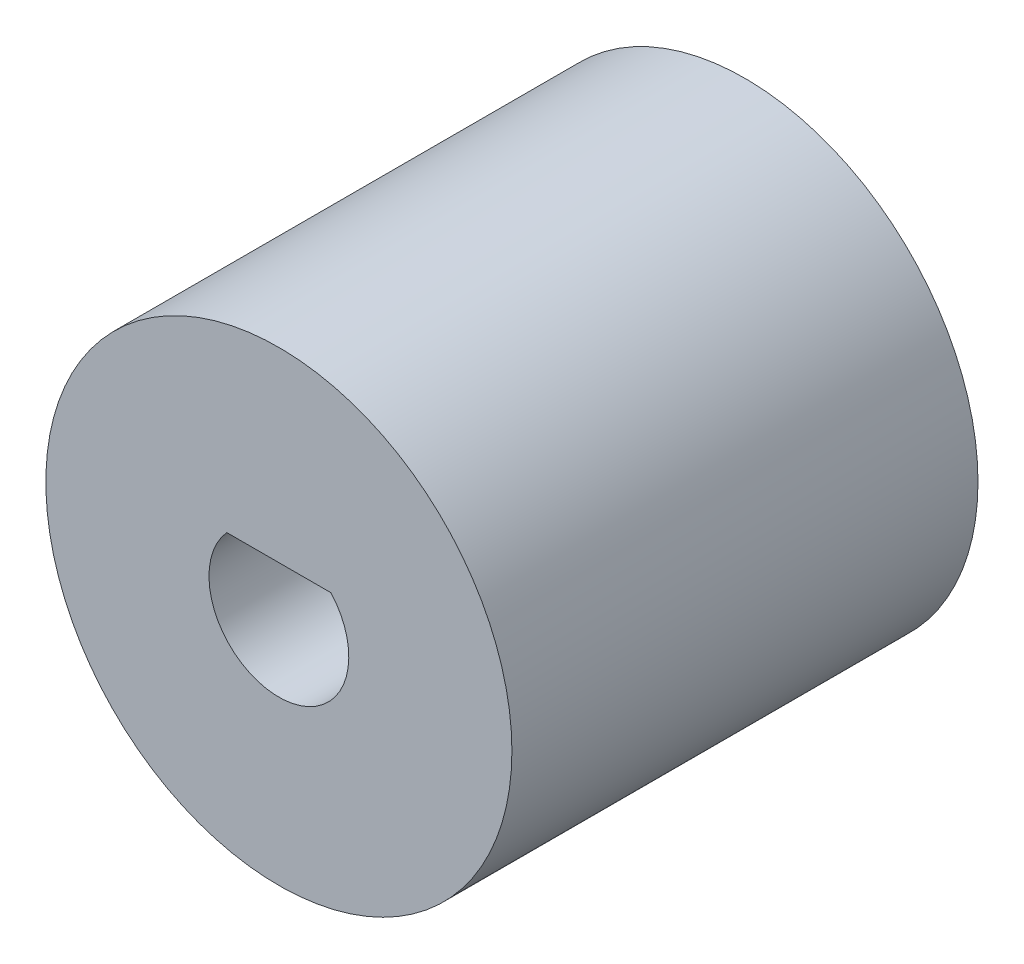
ISO-10303-21;
HEADER;
FILE_DESCRIPTION(('STEP AP214'),'2;1');
FILE_NAME('part.step','',(''),(''),'','','');
FILE_SCHEMA(('AUTOMOTIVE_DESIGN { 1 0 10303 214 1 1 1 1 }'));
ENDSEC;
DATA;
#1=APPLICATION_CONTEXT('core data for automotive mechanical design processes');
#2=APPLICATION_PROTOCOL_DEFINITION('international standard','automotive_design',2000,#1);
#3=PRODUCT_CONTEXT('',#1,'mechanical');
#4=PRODUCT('Part','Part','',(#3));
#5=PRODUCT_RELATED_PRODUCT_CATEGORY('part','',(#4));
#6=PRODUCT_DEFINITION_FORMATION('','',#4);
#7=PRODUCT_DEFINITION_CONTEXT('part definition',#1,'design');
#8=PRODUCT_DEFINITION('design','',#6,#7);
#9=PRODUCT_DEFINITION_SHAPE('','',#8);
#10=(LENGTH_UNIT() NAMED_UNIT(*) SI_UNIT(.MILLI.,.METRE.));
#11=(NAMED_UNIT(*) PLANE_ANGLE_UNIT() SI_UNIT($,.RADIAN.));
#12=(NAMED_UNIT(*) SI_UNIT($,.STERADIAN.) SOLID_ANGLE_UNIT());
#13=UNCERTAINTY_MEASURE_WITH_UNIT(LENGTH_MEASURE(1.E-05),#10,'distance_accuracy_value','');
#14=(GEOMETRIC_REPRESENTATION_CONTEXT(3) GLOBAL_UNCERTAINTY_ASSIGNED_CONTEXT((#13)) GLOBAL_UNIT_ASSIGNED_CONTEXT((#10,
#11,#12)) REPRESENTATION_CONTEXT('',''));
#15=CARTESIAN_POINT('',(0.,0.,0.));
#16=DIRECTION('',(0.,0.,1.));
#17=DIRECTION('',(1.,0.,0.));
#18=AXIS2_PLACEMENT_3D('',#15,#16,#17);
#19=CARTESIAN_POINT('',(0.,0.,0.));
#20=DIRECTION('',(0.,0.,1.));
#21=DIRECTION('',(1.,0.,0.));
#22=AXIS2_PLACEMENT_3D('',#19,#20,#21);
#23=PLANE('',#22);
#24=DIRECTION('',(1.,0.,0.));
#25=VECTOR('',#24,1.);
#26=CARTESIAN_POINT('',(0.,1.,0.));
#27=LINE('',#26,#25);
#28=CARTESIAN_POINT('',(-0.800079345703121,1.,0.));
#29=VERTEX_POINT('',#28);
#30=CARTESIAN_POINT('',(0.799911499023441,1.,0.));
#31=VERTEX_POINT('',#30);
#32=EDGE_CURVE('E394',#29,#31,#27,.T.);
#33=ORIENTED_EDGE('',*,*,#32,.F.);
#34=DIRECTION('',(0.,1.,0.));
#35=VECTOR('',#34,1.);
#36=CARTESIAN_POINT('',(-0.800079345703121,0.,0.));
#37=LINE('',#36,#35);
#38=CARTESIAN_POINT('',(-0.800079345703121,2.26272952796905,0.));
#39=VERTEX_POINT('',#38);
#40=EDGE_CURVE('E11',#29,#39,#37,.T.);
#41=ORIENTED_EDGE('',*,*,#40,.T.);
#42=CARTESIAN_POINT('',(0.,0.,0.));
#43=DIRECTION('',(0.,0.,1.));
#44=DIRECTION('',(1.,0.,0.));
#45=AXIS2_PLACEMENT_3D('',#42,#43,#44);
#46=CIRCLE('',#45,2.40001497415408);
#47=CARTESIAN_POINT('',(0.799911499023441,2.26278886993327,0.));
#48=VERTEX_POINT('',#47);
#49=EDGE_CURVE('E67',#48,#39,#46,.T.);
#50=ORIENTED_EDGE('',*,*,#49,.F.);
#51=DIRECTION('',(0.,1.,0.));
#52=VECTOR('',#51,1.);
#53=CARTESIAN_POINT('',(0.799911499023441,0.,0.));
#54=LINE('',#53,#52);
#55=EDGE_CURVE('E55',#31,#48,#54,.T.);
#56=ORIENTED_EDGE('',*,*,#55,.F.);
#57=EDGE_LOOP('',(#33,#41,#50,#56));
#58=FACE_BOUND('',#57,.T.);
#59=ADVANCED_FACE('F45',(#58),#23,.F.);
#60=CARTESIAN_POINT('',(0.,0.,0.));
#61=DIRECTION('',(0.,0.,1.));
#62=DIRECTION('',(1.,0.,0.));
#63=AXIS2_PLACEMENT_3D('',#60,#61,#62);
#64=CIRCLE('',#63,1.5);
#65=CARTESIAN_POINT('',(1.26891354856431,-0.799911499023445,0.));
#66=VERTEX_POINT('',#65);
#67=CARTESIAN_POINT('',(1.26880772403831,0.800079345703117,0.));
#68=VERTEX_POINT('',#67);
#69=EDGE_CURVE('E1076',#66,#68,#64,.T.);
#70=ORIENTED_EDGE('',*,*,#69,.T.);
#71=DIRECTION('',(1.,0.,0.));
#72=VECTOR('',#71,1.);
#73=CARTESIAN_POINT('',(0.,0.800079345703121,0.));
#74=LINE('',#73,#72);
#75=CARTESIAN_POINT('',(2.26272952796906,0.800079345703113,0.));
#76=VERTEX_POINT('',#75);
#77=EDGE_CURVE('E287',#68,#76,#74,.T.);
#78=ORIENTED_EDGE('',*,*,#77,.T.);
#79=CARTESIAN_POINT('',(2.26278886993326,-0.799911499023449,0.));
#80=VERTEX_POINT('',#79);
#81=EDGE_CURVE('E277',#80,#76,#46,.T.);
#82=ORIENTED_EDGE('',*,*,#81,.F.);
#83=DIRECTION('',(1.,0.,0.));
#84=VECTOR('',#83,1.);
#85=CARTESIAN_POINT('',(0.,-0.799911499023441,0.));
#86=LINE('',#85,#84);
#87=EDGE_CURVE('E293',#66,#80,#86,.T.);
#88=ORIENTED_EDGE('',*,*,#87,.F.);
#89=EDGE_LOOP('',(#70,#78,#82,#88));
#90=FACE_BOUND('',#89,.T.);
#91=ADVANCED_FACE('F493',(#90),#23,.F.);
#92=CARTESIAN_POINT('',(-0.799911499023352,-1.26891354856437,0.));
#93=VERTEX_POINT('',#92);
#94=CARTESIAN_POINT('',(0.80007934570321,-1.26880772403825,0.));
#95=VERTEX_POINT('',#94);
#96=EDGE_CURVE('E516',#93,#95,#64,.T.);
#97=ORIENTED_EDGE('',*,*,#96,.T.);
#98=DIRECTION('',(0.,-1.,0.));
#99=VECTOR('',#98,1.);
#100=CARTESIAN_POINT('',(0.80007934570321,0.,0.));
#101=LINE('',#100,#99);
#102=CARTESIAN_POINT('',(0.800079345703191,-2.26272952796909,0.));
#103=VERTEX_POINT('',#102);
#104=EDGE_CURVE('E302',#95,#103,#101,.T.);
#105=ORIENTED_EDGE('',*,*,#104,.T.);
#106=CARTESIAN_POINT('',(-0.799911499023343,-2.26278886993333,0.));
#107=VERTEX_POINT('',#106);
#108=EDGE_CURVE('E301',#107,#103,#46,.T.);
#109=ORIENTED_EDGE('',*,*,#108,.F.);
#110=DIRECTION('',(0.,-1.,0.));
#111=VECTOR('',#110,1.);
#112=CARTESIAN_POINT('',(-0.799911499023352,0.,0.));
#113=LINE('',#112,#111);
#114=EDGE_CURVE('E308',#93,#107,#113,.T.);
#115=ORIENTED_EDGE('',*,*,#114,.F.);
#116=EDGE_LOOP('',(#97,#105,#109,#115));
#117=FACE_BOUND('',#116,.T.);
#118=ADVANCED_FACE('F498',(#117),#23,.F.);
#119=CARTESIAN_POINT('',(0.,0.,5.));
#120=DIRECTION('',(0.,0.,-1.));
#121=DIRECTION('',(-1.,0.,0.));
#122=AXIS2_PLACEMENT_3D('',#119,#120,#121);
#123=CYLINDRICAL_SURFACE('',#122,1.5);
#124=CARTESIAN_POINT('',(-1.11803398874989,1.,0.));
#125=VERTEX_POINT('',#124);
#126=CARTESIAN_POINT('',(-1.26891354856433,0.799911499023418,0.));
#127=VERTEX_POINT('',#126);
#128=EDGE_CURVE('E386',#125,#127,#64,.T.);
#129=ORIENTED_EDGE('',*,*,#128,.F.);
#130=DIRECTION('',(0.,0.,-1.));
#131=VECTOR('',#130,1.);
#132=CARTESIAN_POINT('',(-1.11803398874989,1.,5.));
#133=LINE('',#132,#131);
#134=CARTESIAN_POINT('',(-1.11803398874989,1.,5.));
#135=VERTEX_POINT('',#134);
#136=EDGE_CURVE('E49',#135,#125,#133,.T.);
#137=ORIENTED_EDGE('',*,*,#136,.F.);
#138=CARTESIAN_POINT('',(0.,0.,5.));
#139=DIRECTION('',(0.,0.,1.));
#140=DIRECTION('',(1.,0.,0.));
#141=AXIS2_PLACEMENT_3D('',#138,#139,#140);
#142=CIRCLE('',#141,1.5);
#143=CARTESIAN_POINT('',(1.11803398874989,1.,5.));
#144=VERTEX_POINT('',#143);
#145=EDGE_CURVE('E373',#135,#144,#142,.T.);
#146=ORIENTED_EDGE('',*,*,#145,.T.);
#147=DIRECTION('',(0.,0.,-1.));
#148=VECTOR('',#147,1.);
#149=CARTESIAN_POINT('',(1.11803398874989,1.,5.));
#150=LINE('',#149,#148);
#151=CARTESIAN_POINT('',(1.11803398874989,1.,0.));
#152=VERTEX_POINT('',#151);
#153=EDGE_CURVE('E385',#144,#152,#150,.T.);
#154=ORIENTED_EDGE('',*,*,#153,.T.);
#155=EDGE_CURVE('E322',#68,#152,#64,.T.);
#156=ORIENTED_EDGE('',*,*,#155,.F.);
#157=ORIENTED_EDGE('',*,*,#69,.F.);
#158=EDGE_CURVE('E520',#95,#66,#64,.T.);
#159=ORIENTED_EDGE('',*,*,#158,.F.);
#160=ORIENTED_EDGE('',*,*,#96,.F.);
#161=CARTESIAN_POINT('',(-1.26880772403829,-0.800079345703144,0.));
#162=VERTEX_POINT('',#161);
#163=EDGE_CURVE('E519',#162,#93,#64,.T.);
#164=ORIENTED_EDGE('',*,*,#163,.F.);
#165=EDGE_CURVE('E391',#127,#162,#64,.T.);
#166=ORIENTED_EDGE('',*,*,#165,.F.);
#167=EDGE_LOOP('',(#129,#137,#146,#154,#156,#157,#159,#160,#164,#166));
#168=FACE_BOUND('',#167,.T.);
#169=ADVANCED_FACE('F47',(#168),#123,.F.);
#170=CARTESIAN_POINT('',(0.,1.,5.));
#171=DIRECTION('',(0.,1.,0.));
#172=DIRECTION('',(0.,0.,1.));
#173=AXIS2_PLACEMENT_3D('',#170,#171,#172);
#174=PLANE('',#173);
#175=EDGE_CURVE('E378',#125,#29,#27,.T.);
#176=ORIENTED_EDGE('',*,*,#175,.T.);
#177=ORIENTED_EDGE('',*,*,#32,.T.);
#178=EDGE_CURVE('E390',#31,#152,#27,.T.);
#179=ORIENTED_EDGE('',*,*,#178,.T.);
#180=ORIENTED_EDGE('',*,*,#153,.F.);
#181=DIRECTION('',(1.,0.,0.));
#182=VECTOR('',#181,1.);
#183=CARTESIAN_POINT('',(0.,1.,5.));
#184=LINE('',#183,#182);
#185=EDGE_CURVE('E377',#135,#144,#184,.T.);
#186=ORIENTED_EDGE('',*,*,#185,.F.);
#187=ORIENTED_EDGE('',*,*,#136,.T.);
#188=EDGE_LOOP('',(#176,#177,#179,#180,#186,#187));
#189=FACE_BOUND('',#188,.T.);
#190=ADVANCED_FACE('F491',(#189),#174,.F.);
#191=CARTESIAN_POINT('',(0.,0.,5.));
#192=DIRECTION('',(0.,0.,-1.));
#193=DIRECTION('',(-1.,0.,0.));
#194=AXIS2_PLACEMENT_3D('',#191,#192,#193);
#195=CYLINDRICAL_SURFACE('',#194,5.);
#196=CARTESIAN_POINT('',(0.,0.,5.));
#197=DIRECTION('',(0.,0.,1.));
#198=DIRECTION('',(1.,0.,0.));
#199=AXIS2_PLACEMENT_3D('',#196,#197,#198);
#200=CIRCLE('',#199,5.);
#201=CARTESIAN_POINT('',(5.,0.,5.));
#202=VERTEX_POINT('',#201);
#203=EDGE_CURVE('E381',#202,#202,#200,.T.);
#204=ORIENTED_EDGE('',*,*,#203,.F.);
#205=EDGE_LOOP('',(#204));
#206=FACE_BOUND('',#205,.T.);
#207=CARTESIAN_POINT('',(0.,0.,-5.));
#208=DIRECTION('',(0.,0.,1.));
#209=DIRECTION('',(1.,0.,0.));
#210=AXIS2_PLACEMENT_3D('',#207,#208,#209);
#211=CIRCLE('',#210,5.);
#212=CARTESIAN_POINT('',(5.,0.,-5.));
#213=VERTEX_POINT('',#212);
#214=EDGE_CURVE('E206',#213,#213,#211,.T.);
#215=ORIENTED_EDGE('',*,*,#214,.T.);
#216=EDGE_LOOP('',(#215));
#217=FACE_BOUND('',#216,.T.);
#218=ADVANCED_FACE('F510',(#206,#217),#195,.T.);
#219=CARTESIAN_POINT('',(0.,0.,5.));
#220=DIRECTION('',(0.,0.,1.));
#221=DIRECTION('',(1.,0.,0.));
#222=AXIS2_PLACEMENT_3D('',#219,#220,#221);
#223=PLANE('',#222);
#224=ORIENTED_EDGE('',*,*,#145,.F.);
#225=ORIENTED_EDGE('',*,*,#185,.T.);
#226=EDGE_LOOP('',(#224,#225));
#227=FACE_BOUND('',#226,.T.);
#228=ORIENTED_EDGE('',*,*,#203,.T.);
#229=EDGE_LOOP('',(#228));
#230=FACE_BOUND('',#229,.T.);
#231=ADVANCED_FACE('F503',(#227,#230),#223,.T.);
#232=ORIENTED_EDGE('',*,*,#165,.T.);
#233=DIRECTION('',(-1.,0.,0.));
#234=VECTOR('',#233,1.);
#235=CARTESIAN_POINT('',(0.,-0.800079345703059,0.));
#236=LINE('',#235,#234);
#237=CARTESIAN_POINT('',(-2.26272952796904,-0.800079345703206,0.));
#238=VERTEX_POINT('',#237);
#239=EDGE_CURVE('E315',#162,#238,#236,.T.);
#240=ORIENTED_EDGE('',*,*,#239,.T.);
#241=CARTESIAN_POINT('',(-2.26278886993328,0.799911499023356,0.));
#242=VERTEX_POINT('',#241);
#243=EDGE_CURVE('E276',#242,#238,#46,.T.);
#244=ORIENTED_EDGE('',*,*,#243,.F.);
#245=DIRECTION('',(-1.,0.,0.));
#246=VECTOR('',#245,1.);
#247=CARTESIAN_POINT('',(0.,0.799911499023503,0.));
#248=LINE('',#247,#246);
#249=EDGE_CURVE('E319',#127,#242,#248,.T.);
#250=ORIENTED_EDGE('',*,*,#249,.F.);
#251=EDGE_LOOP('',(#232,#240,#244,#250));
#252=FACE_BOUND('',#251,.T.);
#253=ADVANCED_FACE('F495',(#252),#23,.F.);
#254=CARTESIAN_POINT('',(0.,0.,0.));
#255=DIRECTION('',(0.,0.,1.));
#256=DIRECTION('',(1.,0.,0.));
#257=AXIS2_PLACEMENT_3D('',#254,#255,#256);
#258=PLANE('',#257);
#259=CARTESIAN_POINT('',(-0.800017929077155,-0.800079345703113,0.));
#260=VERTEX_POINT('',#259);
#261=EDGE_CURVE('E311',#260,#162,#236,.T.);
#262=ORIENTED_EDGE('',*,*,#261,.T.);
#263=ORIENTED_EDGE('',*,*,#163,.T.);
#264=CARTESIAN_POINT('',(-0.799911499023352,-0.800017929077237,0.));
#265=VERTEX_POINT('',#264);
#266=EDGE_CURVE('E303',#265,#93,#113,.T.);
#267=ORIENTED_EDGE('',*,*,#266,.F.);
#268=DIRECTION('',(0.866133899009533,0.499812033655197,0.));
#269=VECTOR('',#268,1.);
#270=CARTESIAN_POINT('',(0.146503531380037,-0.253878791042465,0.));
#271=LINE('',#270,#269);
#272=EDGE_CURVE('E307',#260,#265,#271,.T.);
#273=ORIENTED_EDGE('',*,*,#272,.F.);
#274=EDGE_LOOP('',(#262,#263,#267,#273));
#275=FACE_BOUND('',#274,.T.);
#276=ADVANCED_FACE('F502',(#275),#258,.T.);
#277=CARTESIAN_POINT('',(0.80007934570321,-0.800017929077237,0.));
#278=VERTEX_POINT('',#277);
#279=EDGE_CURVE('E297',#278,#95,#101,.T.);
#280=ORIENTED_EDGE('',*,*,#279,.T.);
#281=ORIENTED_EDGE('',*,*,#158,.T.);
#282=CARTESIAN_POINT('',(0.800017929077144,-0.799911499023444,0.));
#283=VERTEX_POINT('',#282);
#284=EDGE_CURVE('E288',#283,#66,#86,.T.);
#285=ORIENTED_EDGE('',*,*,#284,.F.);
#286=DIRECTION('',(0.499812034853803,-0.866133898317864,0.));
#287=VECTOR('',#286,1.);
#288=CARTESIAN_POINT('',(0.253878789529911,0.146503530975527,0.));
#289=LINE('',#288,#287);
#290=EDGE_CURVE('E292',#283,#278,#289,.T.);
#291=ORIENTED_EDGE('',*,*,#290,.T.);
#292=EDGE_LOOP('',(#280,#281,#285,#291));
#293=FACE_BOUND('',#292,.T.);
#294=ADVANCED_FACE('F507',(#293),#258,.T.);
#295=ORIENTED_EDGE('',*,*,#175,.F.);
#296=ORIENTED_EDGE('',*,*,#128,.T.);
#297=CARTESIAN_POINT('',(-0.800017929077139,0.799911499023449,0.));
#298=VERTEX_POINT('',#297);
#299=EDGE_CURVE('E216',#298,#127,#248,.T.);
#300=ORIENTED_EDGE('',*,*,#299,.F.);
#301=DIRECTION('',(0.499812034681022,-0.866133898417569,0.));
#302=VECTOR('',#301,1.);
#303=CARTESIAN_POINT('',(-0.253878789747926,-0.146503531033825,0.));
#304=LINE('',#303,#302);
#305=CARTESIAN_POINT('',(-0.800079345703121,0.800017929077147,0.));
#306=VERTEX_POINT('',#305);
#307=EDGE_CURVE('E269',#306,#298,#304,.T.);
#308=ORIENTED_EDGE('',*,*,#307,.F.);
#309=EDGE_CURVE('E57',#306,#29,#37,.T.);
#310=ORIENTED_EDGE('',*,*,#309,.T.);
#311=EDGE_LOOP('',(#295,#296,#300,#308,#310));
#312=FACE_BOUND('',#311,.T.);
#313=ADVANCED_FACE('F444',(#312),#258,.T.);
#314=CARTESIAN_POINT('',(-0.253878789747926,-0.146503531033825,-5.));
#315=DIRECTION('',(-0.866133898417569,-0.499812034681022,0.));
#316=DIRECTION('',(0.499812034681022,-0.866133898417569,0.));
#317=AXIS2_PLACEMENT_3D('',#314,#315,#316);
#318=PLANE('',#317);
#319=ORIENTED_EDGE('',*,*,#307,.T.);
#320=DIRECTION('',(0.,0.,1.));
#321=VECTOR('',#320,1.);
#322=CARTESIAN_POINT('',(-0.800017929077139,0.799911499023449,-5.));
#323=LINE('',#322,#321);
#324=CARTESIAN_POINT('',(-0.800017929077139,0.799911499023449,-5.));
#325=VERTEX_POINT('',#324);
#326=EDGE_CURVE('E213',#325,#298,#323,.T.);
#327=ORIENTED_EDGE('',*,*,#326,.F.);
#328=DIRECTION('',(0.499812034681022,-0.866133898417569,0.));
#329=VECTOR('',#328,1.);
#330=CARTESIAN_POINT('',(-0.253878789747926,-0.146503531033825,-5.));
#331=LINE('',#330,#329);
#332=CARTESIAN_POINT('',(-0.800079345703121,0.800017929077147,-5.));
#333=VERTEX_POINT('',#332);
#334=EDGE_CURVE('E210',#333,#325,#331,.T.);
#335=ORIENTED_EDGE('',*,*,#334,.F.);
#336=DIRECTION('',(0.,0.,1.));
#337=VECTOR('',#336,1.);
#338=CARTESIAN_POINT('',(-0.800079345703121,0.800017929077147,-5.));
#339=LINE('',#338,#337);
#340=EDGE_CURVE('E195',#333,#306,#339,.T.);
#341=ORIENTED_EDGE('',*,*,#340,.T.);
#342=EDGE_LOOP('',(#319,#327,#335,#341));
#343=FACE_BOUND('',#342,.T.);
#344=ADVANCED_FACE('F211',(#343),#318,.F.);
#345=CARTESIAN_POINT('',(0.,0.799911499023503,-5.));
#346=DIRECTION('',(0.,1.,0.));
#347=DIRECTION('',(-1.,0.,0.));
#348=AXIS2_PLACEMENT_3D('',#345,#346,#347);
#349=PLANE('',#348);
#350=ORIENTED_EDGE('',*,*,#299,.T.);
#351=ORIENTED_EDGE('',*,*,#249,.T.);
#352=DIRECTION('',(0.,0.,1.));
#353=VECTOR('',#352,1.);
#354=CARTESIAN_POINT('',(-2.26278886993328,0.799911499023356,-5.));
#355=LINE('',#354,#353);
#356=CARTESIAN_POINT('',(-2.26278886993328,0.799911499023356,-5.));
#357=VERTEX_POINT('',#356);
#358=EDGE_CURVE('E323',#357,#242,#355,.T.);
#359=ORIENTED_EDGE('',*,*,#358,.F.);
#360=DIRECTION('',(-1.,0.,0.));
#361=VECTOR('',#360,1.);
#362=CARTESIAN_POINT('',(0.,0.799911499023503,-5.));
#363=LINE('',#362,#361);
#364=EDGE_CURVE('E263',#325,#357,#363,.T.);
#365=ORIENTED_EDGE('',*,*,#364,.F.);
#366=ORIENTED_EDGE('',*,*,#326,.T.);
#367=EDGE_LOOP('',(#350,#351,#359,#365,#366));
#368=FACE_BOUND('',#367,.T.);
#369=ADVANCED_FACE('F445',(#368),#349,.F.);
#370=CARTESIAN_POINT('',(0.,0.,-5.));
#371=DIRECTION('',(0.,0.,1.));
#372=DIRECTION('',(1.,0.,0.));
#373=AXIS2_PLACEMENT_3D('',#370,#371,#372);
#374=CYLINDRICAL_SURFACE('',#373,2.40001497415408);
#375=ORIENTED_EDGE('',*,*,#243,.T.);
#376=DIRECTION('',(0.,0.,1.));
#377=VECTOR('',#376,1.);
#378=CARTESIAN_POINT('',(-2.26272952796904,-0.800079345703206,-5.));
#379=LINE('',#378,#377);
#380=CARTESIAN_POINT('',(-2.26272952796904,-0.800079345703206,-5.));
#381=VERTEX_POINT('',#380);
#382=EDGE_CURVE('E327',#381,#238,#379,.T.);
#383=ORIENTED_EDGE('',*,*,#382,.F.);
#384=CARTESIAN_POINT('',(0.,0.,-5.));
#385=DIRECTION('',(0.,0.,1.));
#386=DIRECTION('',(1.,0.,0.));
#387=AXIS2_PLACEMENT_3D('',#384,#385,#386);
#388=CIRCLE('',#387,2.40001497415408);
#389=EDGE_CURVE('E229',#357,#381,#388,.T.);
#390=ORIENTED_EDGE('',*,*,#389,.F.);
#391=ORIENTED_EDGE('',*,*,#358,.T.);
#392=EDGE_LOOP('',(#375,#383,#390,#391));
#393=FACE_BOUND('',#392,.T.);
#394=ADVANCED_FACE('F451',(#393),#374,.F.);
#395=CARTESIAN_POINT('',(0.,-0.800079345703059,-5.));
#396=DIRECTION('',(0.,1.,0.));
#397=DIRECTION('',(-1.,0.,0.));
#398=AXIS2_PLACEMENT_3D('',#395,#396,#397);
#399=PLANE('',#398);
#400=ORIENTED_EDGE('',*,*,#261,.F.);
#401=DIRECTION('',(0.,0.,1.));
#402=VECTOR('',#401,1.);
#403=CARTESIAN_POINT('',(-0.800017929077155,-0.800079345703113,-5.));
#404=LINE('',#403,#402);
#405=CARTESIAN_POINT('',(-0.800017929077155,-0.800079345703113,-5.));
#406=VERTEX_POINT('',#405);
#407=EDGE_CURVE('E331',#406,#260,#404,.T.);
#408=ORIENTED_EDGE('',*,*,#407,.F.);
#409=DIRECTION('',(-1.,0.,0.));
#410=VECTOR('',#409,1.);
#411=CARTESIAN_POINT('',(0.,-0.800079345703059,-5.));
#412=LINE('',#411,#410);
#413=EDGE_CURVE('E259',#406,#381,#412,.T.);
#414=ORIENTED_EDGE('',*,*,#413,.T.);
#415=ORIENTED_EDGE('',*,*,#382,.T.);
#416=ORIENTED_EDGE('',*,*,#239,.F.);
#417=EDGE_LOOP('',(#400,#408,#414,#415,#416));
#418=FACE_BOUND('',#417,.T.);
#419=ADVANCED_FACE('F454',(#418),#399,.T.);
#420=CARTESIAN_POINT('',(0.146503531380037,-0.253878791042465,-5.));
#421=DIRECTION('',(0.499812033655197,-0.866133899009534,0.));
#422=DIRECTION('',(0.866133899009533,0.499812033655197,0.));
#423=AXIS2_PLACEMENT_3D('',#420,#421,#422);
#424=PLANE('',#423);
#425=ORIENTED_EDGE('',*,*,#272,.T.);
#426=DIRECTION('',(0.,0.,1.));
#427=VECTOR('',#426,1.);
#428=CARTESIAN_POINT('',(-0.799911499023352,-0.800017929077237,-5.));
#429=LINE('',#428,#427);
#430=CARTESIAN_POINT('',(-0.799911499023352,-0.800017929077237,-5.));
#431=VERTEX_POINT('',#430);
#432=EDGE_CURVE('E334',#431,#265,#429,.T.);
#433=ORIENTED_EDGE('',*,*,#432,.F.);
#434=DIRECTION('',(0.866133899009533,0.499812033655197,0.));
#435=VECTOR('',#434,1.);
#436=CARTESIAN_POINT('',(0.146503531380037,-0.253878791042465,-5.));
#437=LINE('',#436,#435);
#438=EDGE_CURVE('E256',#406,#431,#437,.T.);
#439=ORIENTED_EDGE('',*,*,#438,.F.);
#440=ORIENTED_EDGE('',*,*,#407,.T.);
#441=EDGE_LOOP('',(#425,#433,#439,#440));
#442=FACE_BOUND('',#441,.T.);
#443=ADVANCED_FACE('F459',(#442),#424,.F.);
#444=CARTESIAN_POINT('',(-0.799911499023352,0.,-5.));
#445=DIRECTION('',(-1.,0.,0.));
#446=DIRECTION('',(0.,-1.,0.));
#447=AXIS2_PLACEMENT_3D('',#444,#445,#446);
#448=PLANE('',#447);
#449=ORIENTED_EDGE('',*,*,#266,.T.);
#450=ORIENTED_EDGE('',*,*,#114,.T.);
#451=DIRECTION('',(0.,0.,1.));
#452=VECTOR('',#451,1.);
#453=CARTESIAN_POINT('',(-0.799911499023343,-2.26278886993333,-5.));
#454=LINE('',#453,#452);
#455=CARTESIAN_POINT('',(-0.799911499023343,-2.26278886993333,-5.));
#456=VERTEX_POINT('',#455);
#457=EDGE_CURVE('E338',#456,#107,#454,.T.);
#458=ORIENTED_EDGE('',*,*,#457,.F.);
#459=DIRECTION('',(0.,-1.,0.));
#460=VECTOR('',#459,1.);
#461=CARTESIAN_POINT('',(-0.799911499023352,0.,-5.));
#462=LINE('',#461,#460);
#463=EDGE_CURVE('E253',#431,#456,#462,.T.);
#464=ORIENTED_EDGE('',*,*,#463,.F.);
#465=ORIENTED_EDGE('',*,*,#432,.T.);
#466=EDGE_LOOP('',(#449,#450,#458,#464,#465));
#467=FACE_BOUND('',#466,.T.);
#468=ADVANCED_FACE('F464',(#467),#448,.F.);
#469=ORIENTED_EDGE('',*,*,#108,.T.);
#470=DIRECTION('',(0.,0.,1.));
#471=VECTOR('',#470,1.);
#472=CARTESIAN_POINT('',(0.800079345703191,-2.26272952796909,-5.));
#473=LINE('',#472,#471);
#474=CARTESIAN_POINT('',(0.800079345703191,-2.26272952796909,-5.));
#475=VERTEX_POINT('',#474);
#476=EDGE_CURVE('E342',#475,#103,#473,.T.);
#477=ORIENTED_EDGE('',*,*,#476,.F.);
#478=EDGE_CURVE('E252',#456,#475,#388,.T.);
#479=ORIENTED_EDGE('',*,*,#478,.F.);
#480=ORIENTED_EDGE('',*,*,#457,.T.);
#481=EDGE_LOOP('',(#469,#477,#479,#480));
#482=FACE_BOUND('',#481,.T.);
#483=ADVANCED_FACE('F467',(#482),#374,.F.);
#484=CARTESIAN_POINT('',(0.80007934570321,0.,-5.));
#485=DIRECTION('',(-1.,0.,0.));
#486=DIRECTION('',(0.,-1.,0.));
#487=AXIS2_PLACEMENT_3D('',#484,#485,#486);
#488=PLANE('',#487);
#489=ORIENTED_EDGE('',*,*,#279,.F.);
#490=DIRECTION('',(0.,0.,1.));
#491=VECTOR('',#490,1.);
#492=CARTESIAN_POINT('',(0.80007934570321,-0.800017929077237,-5.));
#493=LINE('',#492,#491);
#494=CARTESIAN_POINT('',(0.80007934570321,-0.800017929077237,-5.));
#495=VERTEX_POINT('',#494);
#496=EDGE_CURVE('E346',#495,#278,#493,.T.);
#497=ORIENTED_EDGE('',*,*,#496,.F.);
#498=DIRECTION('',(0.,-1.,0.));
#499=VECTOR('',#498,1.);
#500=CARTESIAN_POINT('',(0.80007934570321,0.,-5.));
#501=LINE('',#500,#499);
#502=EDGE_CURVE('E248',#495,#475,#501,.T.);
#503=ORIENTED_EDGE('',*,*,#502,.T.);
#504=ORIENTED_EDGE('',*,*,#476,.T.);
#505=ORIENTED_EDGE('',*,*,#104,.F.);
#506=EDGE_LOOP('',(#489,#497,#503,#504,#505));
#507=FACE_BOUND('',#506,.T.);
#508=ADVANCED_FACE('F523',(#507),#488,.T.);
#509=CARTESIAN_POINT('',(0.253878789529911,0.146503530975527,-5.));
#510=DIRECTION('',(-0.866133898317865,-0.499812034853803,0.));
#511=DIRECTION('',(0.499812034853803,-0.866133898317865,0.));
#512=AXIS2_PLACEMENT_3D('',#509,#510,#511);
#513=PLANE('',#512);
#514=ORIENTED_EDGE('',*,*,#290,.F.);
#515=DIRECTION('',(0.,0.,1.));
#516=VECTOR('',#515,1.);
#517=CARTESIAN_POINT('',(0.800017929077144,-0.799911499023444,-5.));
#518=LINE('',#517,#516);
#519=CARTESIAN_POINT('',(0.800017929077144,-0.799911499023444,-5.));
#520=VERTEX_POINT('',#519);
#521=EDGE_CURVE('E349',#520,#283,#518,.T.);
#522=ORIENTED_EDGE('',*,*,#521,.F.);
#523=DIRECTION('',(0.499812034853803,-0.866133898317864,0.));
#524=VECTOR('',#523,1.);
#525=CARTESIAN_POINT('',(0.253878789529911,0.146503530975527,-5.));
#526=LINE('',#525,#524);
#527=EDGE_CURVE('E244',#520,#495,#526,.T.);
#528=ORIENTED_EDGE('',*,*,#527,.T.);
#529=ORIENTED_EDGE('',*,*,#496,.T.);
#530=EDGE_LOOP('',(#514,#522,#528,#529));
#531=FACE_BOUND('',#530,.T.);
#532=ADVANCED_FACE('F529',(#531),#513,.T.);
#533=CARTESIAN_POINT('',(0.,-0.799911499023441,-5.));
#534=DIRECTION('',(0.,-1.,0.));
#535=DIRECTION('',(1.,0.,0.));
#536=AXIS2_PLACEMENT_3D('',#533,#534,#535);
#537=PLANE('',#536);
#538=ORIENTED_EDGE('',*,*,#284,.T.);
#539=ORIENTED_EDGE('',*,*,#87,.T.);
#540=DIRECTION('',(0.,0.,1.));
#541=VECTOR('',#540,1.);
#542=CARTESIAN_POINT('',(2.26278886993326,-0.799911499023449,-5.));
#543=LINE('',#542,#541);
#544=CARTESIAN_POINT('',(2.26278886993326,-0.799911499023449,-5.));
#545=VERTEX_POINT('',#544);
#546=EDGE_CURVE('E352',#545,#80,#543,.T.);
#547=ORIENTED_EDGE('',*,*,#546,.F.);
#548=DIRECTION('',(1.,0.,0.));
#549=VECTOR('',#548,1.);
#550=CARTESIAN_POINT('',(0.,-0.799911499023441,-5.));
#551=LINE('',#550,#549);
#552=EDGE_CURVE('E241',#520,#545,#551,.T.);
#553=ORIENTED_EDGE('',*,*,#552,.F.);
#554=ORIENTED_EDGE('',*,*,#521,.T.);
#555=EDGE_LOOP('',(#538,#539,#547,#553,#554));
#556=FACE_BOUND('',#555,.T.);
#557=ADVANCED_FACE('F530',(#556),#537,.F.);
#558=ORIENTED_EDGE('',*,*,#81,.T.);
#559=DIRECTION('',(0.,0.,1.));
#560=VECTOR('',#559,1.);
#561=CARTESIAN_POINT('',(2.26272952796906,0.800079345703113,-5.));
#562=LINE('',#561,#560);
#563=CARTESIAN_POINT('',(2.26272952796906,0.800079345703113,-5.));
#564=VERTEX_POINT('',#563);
#565=EDGE_CURVE('E356',#564,#76,#562,.T.);
#566=ORIENTED_EDGE('',*,*,#565,.F.);
#567=EDGE_CURVE('E230',#545,#564,#388,.T.);
#568=ORIENTED_EDGE('',*,*,#567,.F.);
#569=ORIENTED_EDGE('',*,*,#546,.T.);
#570=EDGE_LOOP('',(#558,#566,#568,#569));
#571=FACE_BOUND('',#570,.T.);
#572=ADVANCED_FACE('F477',(#571),#374,.F.);
#573=CARTESIAN_POINT('',(0.,0.800079345703121,-5.));
#574=DIRECTION('',(0.,-1.,0.));
#575=DIRECTION('',(1.,0.,0.));
#576=AXIS2_PLACEMENT_3D('',#573,#574,#575);
#577=PLANE('',#576);
#578=CARTESIAN_POINT('',(0.80001792907715,0.800079345703118,0.));
#579=VERTEX_POINT('',#578);
#580=EDGE_CURVE('E284',#579,#68,#74,.T.);
#581=ORIENTED_EDGE('',*,*,#580,.F.);
#582=DIRECTION('',(0.,0.,1.));
#583=VECTOR('',#582,1.);
#584=CARTESIAN_POINT('',(0.80001792907715,0.800079345703118,-5.));
#585=LINE('',#584,#583);
#586=CARTESIAN_POINT('',(0.80001792907715,0.800079345703118,-5.));
#587=VERTEX_POINT('',#586);
#588=EDGE_CURVE('E360',#587,#579,#585,.T.);
#589=ORIENTED_EDGE('',*,*,#588,.F.);
#590=DIRECTION('',(1.,0.,0.));
#591=VECTOR('',#590,1.);
#592=CARTESIAN_POINT('',(0.,0.800079345703121,-5.));
#593=LINE('',#592,#591);
#594=EDGE_CURVE('E237',#587,#564,#593,.T.);
#595=ORIENTED_EDGE('',*,*,#594,.T.);
#596=ORIENTED_EDGE('',*,*,#565,.T.);
#597=ORIENTED_EDGE('',*,*,#77,.F.);
#598=EDGE_LOOP('',(#581,#589,#595,#596,#597));
#599=FACE_BOUND('',#598,.T.);
#600=ADVANCED_FACE('F480',(#599),#577,.T.);
#601=CARTESIAN_POINT('',(-0.146503531069888,0.253878789882772,-5.));
#602=DIRECTION('',(-0.499812034574165,0.866133898479233,0.));
#603=DIRECTION('',(-0.866133898479233,-0.499812034574165,0.));
#604=AXIS2_PLACEMENT_3D('',#601,#602,#603);
#605=PLANE('',#604);
#606=DIRECTION('',(-0.866133898479233,-0.499812034574165,0.));
#607=VECTOR('',#606,1.);
#608=CARTESIAN_POINT('',(-0.146503531069888,0.253878789882772,0.));
#609=LINE('',#608,#607);
#610=CARTESIAN_POINT('',(0.799911499023441,0.800017929077147,0.));
#611=VERTEX_POINT('',#610);
#612=EDGE_CURVE('E281',#579,#611,#609,.T.);
#613=ORIENTED_EDGE('',*,*,#612,.T.);
#614=DIRECTION('',(0.,0.,1.));
#615=VECTOR('',#614,1.);
#616=CARTESIAN_POINT('',(0.799911499023441,0.800017929077147,-5.));
#617=LINE('',#616,#615);
#618=CARTESIAN_POINT('',(0.799911499023441,0.800017929077147,-5.));
#619=VERTEX_POINT('',#618);
#620=EDGE_CURVE('E363',#619,#611,#617,.T.);
#621=ORIENTED_EDGE('',*,*,#620,.F.);
#622=DIRECTION('',(-0.866133898479233,-0.499812034574165,0.));
#623=VECTOR('',#622,1.);
#624=CARTESIAN_POINT('',(-0.146503531069888,0.253878789882772,-5.));
#625=LINE('',#624,#623);
#626=EDGE_CURVE('E234',#587,#619,#625,.T.);
#627=ORIENTED_EDGE('',*,*,#626,.F.);
#628=ORIENTED_EDGE('',*,*,#588,.T.);
#629=EDGE_LOOP('',(#613,#621,#627,#628));
#630=FACE_BOUND('',#629,.T.);
#631=ADVANCED_FACE('F485',(#630),#605,.F.);
#632=CARTESIAN_POINT('',(0.799911499023441,0.,-5.));
#633=DIRECTION('',(1.,0.,0.));
#634=DIRECTION('',(0.,1.,0.));
#635=AXIS2_PLACEMENT_3D('',#632,#633,#634);
#636=PLANE('',#635);
#637=EDGE_CURVE('E275',#611,#31,#54,.T.);
#638=ORIENTED_EDGE('',*,*,#637,.T.);
#639=ORIENTED_EDGE('',*,*,#55,.T.);
#640=DIRECTION('',(0.,0.,1.));
#641=VECTOR('',#640,1.);
#642=CARTESIAN_POINT('',(0.799911499023441,2.26278886993327,-5.));
#643=LINE('',#642,#641);
#644=CARTESIAN_POINT('',(0.799911499023441,2.26278886993327,-5.));
#645=VERTEX_POINT('',#644);
#646=EDGE_CURVE('E367',#645,#48,#643,.T.);
#647=ORIENTED_EDGE('',*,*,#646,.F.);
#648=DIRECTION('',(0.,1.,0.));
#649=VECTOR('',#648,1.);
#650=CARTESIAN_POINT('',(0.799911499023441,0.,-5.));
#651=LINE('',#650,#649);
#652=EDGE_CURVE('E227',#619,#645,#651,.T.);
#653=ORIENTED_EDGE('',*,*,#652,.F.);
#654=ORIENTED_EDGE('',*,*,#620,.T.);
#655=EDGE_LOOP('',(#638,#639,#647,#653,#654));
#656=FACE_BOUND('',#655,.T.);
#657=ADVANCED_FACE('F436',(#656),#636,.F.);
#658=ORIENTED_EDGE('',*,*,#49,.T.);
#659=DIRECTION('',(0.,0.,1.));
#660=VECTOR('',#659,1.);
#661=CARTESIAN_POINT('',(-0.800079345703121,2.26272952796905,-5.));
#662=LINE('',#661,#660);
#663=CARTESIAN_POINT('',(-0.800079345703121,2.26272952796905,-5.));
#664=VERTEX_POINT('',#663);
#665=EDGE_CURVE('E205',#664,#39,#662,.T.);
#666=ORIENTED_EDGE('',*,*,#665,.F.);
#667=EDGE_CURVE('E221',#645,#664,#388,.T.);
#668=ORIENTED_EDGE('',*,*,#667,.F.);
#669=ORIENTED_EDGE('',*,*,#646,.T.);
#670=EDGE_LOOP('',(#658,#666,#668,#669));
#671=FACE_BOUND('',#670,.T.);
#672=ADVANCED_FACE('F441',(#671),#374,.F.);
#673=CARTESIAN_POINT('',(-0.800079345703121,0.,-5.));
#674=DIRECTION('',(1.,0.,0.));
#675=DIRECTION('',(0.,0.,-1.));
#676=AXIS2_PLACEMENT_3D('',#673,#674,#675);
#677=PLANE('',#676);
#678=ORIENTED_EDGE('',*,*,#309,.F.);
#679=ORIENTED_EDGE('',*,*,#340,.F.);
#680=DIRECTION('',(0.,1.,0.));
#681=VECTOR('',#680,1.);
#682=CARTESIAN_POINT('',(-0.800079345703121,0.,-5.));
#683=LINE('',#682,#681);
#684=EDGE_CURVE('E199',#333,#664,#683,.T.);
#685=ORIENTED_EDGE('',*,*,#684,.T.);
#686=ORIENTED_EDGE('',*,*,#665,.T.);
#687=ORIENTED_EDGE('',*,*,#40,.F.);
#688=EDGE_LOOP('',(#678,#679,#685,#686,#687));
#689=FACE_BOUND('',#688,.T.);
#690=ADVANCED_FACE('F197',(#689),#677,.T.);
#691=CARTESIAN_POINT('',(0.,0.,-5.));
#692=DIRECTION('',(0.,0.,1.));
#693=DIRECTION('',(1.,0.,0.));
#694=AXIS2_PLACEMENT_3D('',#691,#692,#693);
#695=PLANE('',#694);
#696=ORIENTED_EDGE('',*,*,#334,.T.);
#697=ORIENTED_EDGE('',*,*,#364,.T.);
#698=ORIENTED_EDGE('',*,*,#389,.T.);
#699=ORIENTED_EDGE('',*,*,#413,.F.);
#700=ORIENTED_EDGE('',*,*,#438,.T.);
#701=ORIENTED_EDGE('',*,*,#463,.T.);
#702=ORIENTED_EDGE('',*,*,#478,.T.);
#703=ORIENTED_EDGE('',*,*,#502,.F.);
#704=ORIENTED_EDGE('',*,*,#527,.F.);
#705=ORIENTED_EDGE('',*,*,#552,.T.);
#706=ORIENTED_EDGE('',*,*,#567,.T.);
#707=ORIENTED_EDGE('',*,*,#594,.F.);
#708=ORIENTED_EDGE('',*,*,#626,.T.);
#709=ORIENTED_EDGE('',*,*,#652,.T.);
#710=ORIENTED_EDGE('',*,*,#667,.T.);
#711=ORIENTED_EDGE('',*,*,#684,.F.);
#712=EDGE_LOOP('',(#696,#697,#698,#699,#700,#701,#702,#703,#704,#705,#706,#707,#708,#709,#710,#711));
#713=FACE_BOUND('',#712,.T.);
#714=ORIENTED_EDGE('',*,*,#214,.F.);
#715=EDGE_LOOP('',(#714));
#716=FACE_BOUND('',#715,.T.);
#717=ADVANCED_FACE('F218',(#713,#716),#695,.F.);
#718=ORIENTED_EDGE('',*,*,#580,.T.);
#719=ORIENTED_EDGE('',*,*,#155,.T.);
#720=ORIENTED_EDGE('',*,*,#178,.F.);
#721=ORIENTED_EDGE('',*,*,#637,.F.);
#722=ORIENTED_EDGE('',*,*,#612,.F.);
#723=EDGE_LOOP('',(#718,#719,#720,#721,#722));
#724=FACE_BOUND('',#723,.T.);
#725=ADVANCED_FACE('F488',(#724),#258,.T.);
#726=CLOSED_SHELL('',(#59,#91,#118,#169,#190,#218,#231,#253,#276,#294,#313,#344,#369,#394,#419,
#443,#468,#483,#508,#532,#557,#572,#600,#631,#657,#672,#690,#717,#725));
#727=MANIFOLD_SOLID_BREP('B2',#726);
#728=ADVANCED_BREP_SHAPE_REPRESENTATION('',(#18,#727),#14);
#729=SHAPE_DEFINITION_REPRESENTATION(#9,#728);
ENDSEC;
END-ISO-10303-21;
